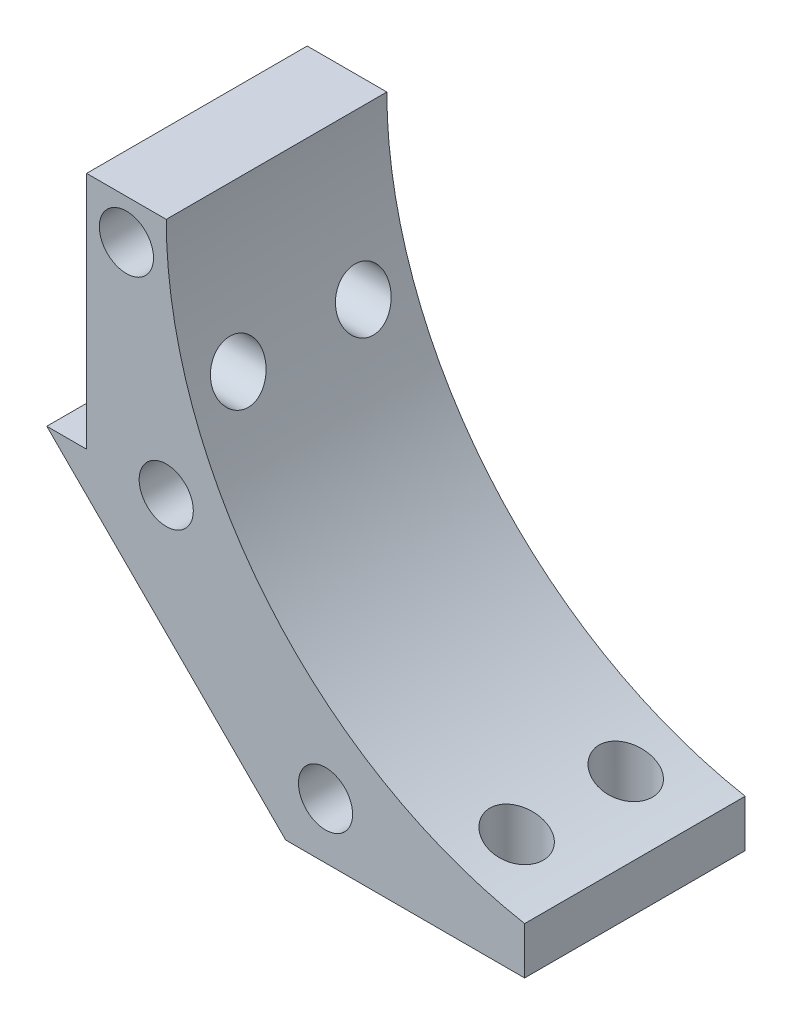
ISO-10303-21;
HEADER;
FILE_DESCRIPTION(('STEP AP214'),'2;1');
FILE_NAME('part.step','',(''),(''),'','','');
FILE_SCHEMA(('AUTOMOTIVE_DESIGN { 1 0 10303 214 1 1 1 1 }'));
ENDSEC;
DATA;
#1=APPLICATION_CONTEXT('core data for automotive mechanical design processes');
#2=APPLICATION_PROTOCOL_DEFINITION('international standard','automotive_design',2000,#1);
#3=PRODUCT_CONTEXT('',#1,'mechanical');
#4=PRODUCT('Part','Part','',(#3));
#5=PRODUCT_RELATED_PRODUCT_CATEGORY('part','',(#4));
#6=PRODUCT_DEFINITION_FORMATION('','',#4);
#7=PRODUCT_DEFINITION_CONTEXT('part definition',#1,'design');
#8=PRODUCT_DEFINITION('design','',#6,#7);
#9=PRODUCT_DEFINITION_SHAPE('','',#8);
#10=(LENGTH_UNIT() NAMED_UNIT(*) SI_UNIT(.MILLI.,.METRE.));
#11=(NAMED_UNIT(*) PLANE_ANGLE_UNIT() SI_UNIT($,.RADIAN.));
#12=(NAMED_UNIT(*) SI_UNIT($,.STERADIAN.) SOLID_ANGLE_UNIT());
#13=UNCERTAINTY_MEASURE_WITH_UNIT(LENGTH_MEASURE(1.E-05),#10,'distance_accuracy_value','');
#14=(GEOMETRIC_REPRESENTATION_CONTEXT(3) GLOBAL_UNCERTAINTY_ASSIGNED_CONTEXT((#13)) GLOBAL_UNIT_ASSIGNED_CONTEXT((#10,
#11,#12)) REPRESENTATION_CONTEXT('',''));
#15=CARTESIAN_POINT('',(0.,0.,0.));
#16=DIRECTION('',(0.,0.,1.));
#17=DIRECTION('',(1.,0.,0.));
#18=AXIS2_PLACEMENT_3D('',#15,#16,#17);
#19=CARTESIAN_POINT('',(0.,30.,27.7));
#20=DIRECTION('',(0.,1.,0.));
#21=DIRECTION('',(0.,0.,1.));
#22=AXIS2_PLACEMENT_3D('',#19,#20,#21);
#23=PLANE('',#22);
#24=DIRECTION('',(1.,0.,0.));
#25=VECTOR('',#24,1.);
#26=CARTESIAN_POINT('',(0.,30.,27.7));
#27=LINE('',#26,#25);
#28=CARTESIAN_POINT('',(0.,30.,27.7));
#29=VERTEX_POINT('',#28);
#30=CARTESIAN_POINT('',(5.,30.,27.7));
#31=VERTEX_POINT('',#30);
#32=EDGE_CURVE('E156',#29,#31,#27,.T.);
#33=ORIENTED_EDGE('',*,*,#32,.T.);
#34=DIRECTION('',(0.,0.,-1.));
#35=VECTOR('',#34,1.);
#36=CARTESIAN_POINT('',(5.,30.,27.7));
#37=LINE('',#36,#35);
#38=CARTESIAN_POINT('',(5.,30.,0.));
#39=VERTEX_POINT('',#38);
#40=EDGE_CURVE('E12',#31,#39,#37,.T.);
#41=ORIENTED_EDGE('',*,*,#40,.T.);
#42=DIRECTION('',(1.,0.,0.));
#43=VECTOR('',#42,1.);
#44=CARTESIAN_POINT('',(0.,30.,0.));
#45=LINE('',#44,#43);
#46=CARTESIAN_POINT('',(0.,30.,0.));
#47=VERTEX_POINT('',#46);
#48=EDGE_CURVE('E164',#47,#39,#45,.T.);
#49=ORIENTED_EDGE('',*,*,#48,.F.);
#50=DIRECTION('',(0.,0.,-1.));
#51=VECTOR('',#50,1.);
#52=CARTESIAN_POINT('',(0.,30.,27.7));
#53=LINE('',#52,#51);
#54=EDGE_CURVE('E145',#29,#47,#53,.T.);
#55=ORIENTED_EDGE('',*,*,#54,.F.);
#56=EDGE_LOOP('',(#33,#41,#49,#55));
#57=FACE_BOUND('',#56,.T.);
#58=ADVANCED_FACE('F74',(#57),#23,.T.);
#59=CARTESIAN_POINT('',(15.,15.,27.7));
#60=DIRECTION('',(0.707106781186548,0.707106781186548,0.));
#61=DIRECTION('',(-0.707106781186548,0.707106781186548,0.));
#62=AXIS2_PLACEMENT_3D('',#59,#60,#61);
#63=PLANE('',#62);
#64=DIRECTION('',(0.707106781186548,-0.707106781186548,0.));
#65=VECTOR('',#64,1.);
#66=CARTESIAN_POINT('',(15.,15.,0.));
#67=LINE('',#66,#65);
#68=CARTESIAN_POINT('',(30.,0.,0.));
#69=VERTEX_POINT('',#68);
#70=EDGE_CURVE('E148',#47,#69,#67,.T.);
#71=ORIENTED_EDGE('',*,*,#70,.T.);
#72=DIRECTION('',(0.,0.,-1.));
#73=VECTOR('',#72,1.);
#74=CARTESIAN_POINT('',(30.,0.,27.7));
#75=LINE('',#74,#73);
#76=CARTESIAN_POINT('',(30.,0.,27.7));
#77=VERTEX_POINT('',#76);
#78=EDGE_CURVE('E89',#77,#69,#75,.T.);
#79=ORIENTED_EDGE('',*,*,#78,.F.);
#80=DIRECTION('',(0.707106781186548,-0.707106781186548,0.));
#81=VECTOR('',#80,1.);
#82=CARTESIAN_POINT('',(15.,15.,27.7));
#83=LINE('',#82,#81);
#84=EDGE_CURVE('E150',#29,#77,#83,.T.);
#85=ORIENTED_EDGE('',*,*,#84,.F.);
#86=ORIENTED_EDGE('',*,*,#54,.T.);
#87=EDGE_LOOP('',(#71,#79,#85,#86));
#88=FACE_BOUND('',#87,.T.);
#89=ADVANCED_FACE('F147',(#88),#63,.F.);
#90=CARTESIAN_POINT('',(0.,0.,0.));
#91=DIRECTION('',(0.,0.,1.));
#92=DIRECTION('',(1.,0.,0.));
#93=AXIS2_PLACEMENT_3D('',#90,#91,#92);
#94=PLANE('',#93);
#95=CARTESIAN_POINT('',(10.,55.,0.));
#96=DIRECTION('',(0.,0.,1.));
#97=DIRECTION('',(1.,0.,0.));
#98=AXIS2_PLACEMENT_3D('',#95,#96,#97);
#99=CIRCLE('',#98,3.4);
#100=CARTESIAN_POINT('',(13.4,55.,0.));
#101=VERTEX_POINT('',#100);
#102=EDGE_CURVE('E292',#101,#101,#99,.T.);
#103=ORIENTED_EDGE('',*,*,#102,.T.);
#104=EDGE_LOOP('',(#103));
#105=FACE_BOUND('',#104,.T.);
#106=CARTESIAN_POINT('',(15.,30.,0.));
#107=DIRECTION('',(0.,0.,1.));
#108=DIRECTION('',(1.,0.,0.));
#109=AXIS2_PLACEMENT_3D('',#106,#107,#108);
#110=CIRCLE('',#109,3.4);
#111=CARTESIAN_POINT('',(18.4,30.,0.));
#112=VERTEX_POINT('',#111);
#113=EDGE_CURVE('E306',#112,#112,#110,.T.);
#114=ORIENTED_EDGE('',*,*,#113,.T.);
#115=EDGE_LOOP('',(#114));
#116=FACE_BOUND('',#115,.T.);
#117=CARTESIAN_POINT('',(35.,7.,0.));
#118=DIRECTION('',(0.,0.,1.));
#119=DIRECTION('',(1.,0.,0.));
#120=AXIS2_PLACEMENT_3D('',#117,#118,#119);
#121=CIRCLE('',#120,3.4);
#122=CARTESIAN_POINT('',(38.4,7.,0.));
#123=VERTEX_POINT('',#122);
#124=EDGE_CURVE('E328',#123,#123,#121,.T.);
#125=ORIENTED_EDGE('',*,*,#124,.T.);
#126=EDGE_LOOP('',(#125));
#127=FACE_BOUND('',#126,.T.);
#128=DIRECTION('',(1.,0.,0.));
#129=VECTOR('',#128,1.);
#130=CARTESIAN_POINT('',(5.,60.,0.));
#131=LINE('',#130,#129);
#132=CARTESIAN_POINT('',(5.,60.,0.));
#133=VERTEX_POINT('',#132);
#134=CARTESIAN_POINT('',(15.,60.,0.));
#135=VERTEX_POINT('',#134);
#136=EDGE_CURVE('E202',#133,#135,#131,.T.);
#137=ORIENTED_EDGE('',*,*,#136,.T.);
#138=CARTESIAN_POINT('',(70.,60.,0.));
#139=DIRECTION('',(0.,0.,1.));
#140=DIRECTION('',(1.,0.,0.));
#141=AXIS2_PLACEMENT_3D('',#138,#139,#140);
#142=CIRCLE('',#141,55.);
#143=CARTESIAN_POINT('',(60.,5.91673086804016,0.));
#144=VERTEX_POINT('',#143);
#145=EDGE_CURVE('E128',#135,#144,#142,.T.);
#146=ORIENTED_EDGE('',*,*,#145,.T.);
#147=DIRECTION('',(0.,-1.,0.));
#148=VECTOR('',#147,1.);
#149=CARTESIAN_POINT('',(60.,30.,0.));
#150=LINE('',#149,#148);
#151=CARTESIAN_POINT('',(60.,0.,0.));
#152=VERTEX_POINT('',#151);
#153=EDGE_CURVE('E184',#144,#152,#150,.T.);
#154=ORIENTED_EDGE('',*,*,#153,.T.);
#155=DIRECTION('',(1.,0.,0.));
#156=VECTOR('',#155,1.);
#157=CARTESIAN_POINT('',(30.,0.,0.));
#158=LINE('',#157,#156);
#159=EDGE_CURVE('E166',#69,#152,#158,.T.);
#160=ORIENTED_EDGE('',*,*,#159,.F.);
#161=ORIENTED_EDGE('',*,*,#70,.F.);
#162=ORIENTED_EDGE('',*,*,#48,.T.);
#163=DIRECTION('',(0.,1.,0.));
#164=VECTOR('',#163,1.);
#165=CARTESIAN_POINT('',(5.,30.,0.));
#166=LINE('',#165,#164);
#167=EDGE_CURVE('E199',#39,#133,#166,.T.);
#168=ORIENTED_EDGE('',*,*,#167,.T.);
#169=EDGE_LOOP('',(#137,#146,#154,#160,#161,#162,#168));
#170=FACE_BOUND('',#169,.T.);
#171=ADVANCED_FACE('F162',(#105,#116,#127,#170),#94,.F.);
#172=CARTESIAN_POINT('',(0.,0.,27.7));
#173=DIRECTION('',(0.,0.,1.));
#174=DIRECTION('',(1.,0.,0.));
#175=AXIS2_PLACEMENT_3D('',#172,#173,#174);
#176=PLANE('',#175);
#177=CARTESIAN_POINT('',(10.,55.,27.7));
#178=DIRECTION('',(0.,0.,1.));
#179=DIRECTION('',(1.,0.,0.));
#180=AXIS2_PLACEMENT_3D('',#177,#178,#179);
#181=CIRCLE('',#180,3.4);
#182=CARTESIAN_POINT('',(13.4,55.,27.7));
#183=VERTEX_POINT('',#182);
#184=EDGE_CURVE('E314',#183,#183,#181,.T.);
#185=ORIENTED_EDGE('',*,*,#184,.F.);
#186=EDGE_LOOP('',(#185));
#187=FACE_BOUND('',#186,.T.);
#188=CARTESIAN_POINT('',(15.,30.,27.7));
#189=DIRECTION('',(0.,0.,1.));
#190=DIRECTION('',(1.,0.,0.));
#191=AXIS2_PLACEMENT_3D('',#188,#189,#190);
#192=CIRCLE('',#191,3.4);
#193=CARTESIAN_POINT('',(18.4,30.,27.7));
#194=VERTEX_POINT('',#193);
#195=EDGE_CURVE('E309',#194,#194,#192,.T.);
#196=ORIENTED_EDGE('',*,*,#195,.F.);
#197=EDGE_LOOP('',(#196));
#198=FACE_BOUND('',#197,.T.);
#199=CARTESIAN_POINT('',(35.,7.,27.7));
#200=DIRECTION('',(0.,0.,1.));
#201=DIRECTION('',(1.,0.,0.));
#202=AXIS2_PLACEMENT_3D('',#199,#200,#201);
#203=CIRCLE('',#202,3.4);
#204=CARTESIAN_POINT('',(38.4,7.,27.7));
#205=VERTEX_POINT('',#204);
#206=EDGE_CURVE('E310',#205,#205,#203,.T.);
#207=ORIENTED_EDGE('',*,*,#206,.F.);
#208=EDGE_LOOP('',(#207));
#209=FACE_BOUND('',#208,.T.);
#210=CARTESIAN_POINT('',(70.,60.,27.7));
#211=DIRECTION('',(0.,0.,1.));
#212=DIRECTION('',(1.,0.,0.));
#213=AXIS2_PLACEMENT_3D('',#210,#211,#212);
#214=CIRCLE('',#213,55.);
#215=CARTESIAN_POINT('',(15.,60.,27.7));
#216=VERTEX_POINT('',#215);
#217=CARTESIAN_POINT('',(60.,5.91673086804016,27.7));
#218=VERTEX_POINT('',#217);
#219=EDGE_CURVE('E97',#216,#218,#214,.T.);
#220=ORIENTED_EDGE('',*,*,#219,.F.);
#221=DIRECTION('',(1.,0.,0.));
#222=VECTOR('',#221,1.);
#223=CARTESIAN_POINT('',(5.,60.,27.7));
#224=LINE('',#223,#222);
#225=CARTESIAN_POINT('',(5.,60.,27.7));
#226=VERTEX_POINT('',#225);
#227=EDGE_CURVE('E194',#226,#216,#224,.T.);
#228=ORIENTED_EDGE('',*,*,#227,.F.);
#229=DIRECTION('',(0.,1.,0.));
#230=VECTOR('',#229,1.);
#231=CARTESIAN_POINT('',(5.,30.,27.7));
#232=LINE('',#231,#230);
#233=EDGE_CURVE('E198',#31,#226,#232,.T.);
#234=ORIENTED_EDGE('',*,*,#233,.F.);
#235=ORIENTED_EDGE('',*,*,#32,.F.);
#236=ORIENTED_EDGE('',*,*,#84,.T.);
#237=DIRECTION('',(1.,0.,0.));
#238=VECTOR('',#237,1.);
#239=CARTESIAN_POINT('',(30.,0.,27.7));
#240=LINE('',#239,#238);
#241=CARTESIAN_POINT('',(60.,0.,27.7));
#242=VERTEX_POINT('',#241);
#243=EDGE_CURVE('E180',#77,#242,#240,.T.);
#244=ORIENTED_EDGE('',*,*,#243,.T.);
#245=DIRECTION('',(0.,-1.,0.));
#246=VECTOR('',#245,1.);
#247=CARTESIAN_POINT('',(60.,30.,27.7));
#248=LINE('',#247,#246);
#249=EDGE_CURVE('E183',#218,#242,#248,.T.);
#250=ORIENTED_EDGE('',*,*,#249,.F.);
#251=EDGE_LOOP('',(#220,#228,#234,#235,#236,#244,#250));
#252=FACE_BOUND('',#251,.T.);
#253=ADVANCED_FACE('F268',(#187,#198,#209,#252),#176,.T.);
#254=CARTESIAN_POINT('',(5.,30.,27.7));
#255=DIRECTION('',(-1.,0.,0.));
#256=DIRECTION('',(0.,-1.,0.));
#257=AXIS2_PLACEMENT_3D('',#254,#255,#256);
#258=PLANE('',#257);
#259=CARTESIAN_POINT('',(5.,42.,6.));
#260=DIRECTION('',(-1.,0.,0.));
#261=DIRECTION('',(0.,-1.,0.));
#262=AXIS2_PLACEMENT_3D('',#259,#260,#261);
#263=CIRCLE('',#262,3.3);
#264=CARTESIAN_POINT('',(5.,38.7,6.));
#265=VERTEX_POINT('',#264);
#266=EDGE_CURVE('E218',#265,#265,#263,.T.);
#267=ORIENTED_EDGE('',*,*,#266,.F.);
#268=EDGE_LOOP('',(#267));
#269=FACE_BOUND('',#268,.T.);
#270=CARTESIAN_POINT('',(5.,42.,21.7));
#271=DIRECTION('',(-1.,0.,0.));
#272=DIRECTION('',(0.,-1.,0.));
#273=AXIS2_PLACEMENT_3D('',#270,#271,#272);
#274=CIRCLE('',#273,3.3);
#275=CARTESIAN_POINT('',(5.,38.7,21.7));
#276=VERTEX_POINT('',#275);
#277=EDGE_CURVE('E281',#276,#276,#274,.T.);
#278=ORIENTED_EDGE('',*,*,#277,.F.);
#279=EDGE_LOOP('',(#278));
#280=FACE_BOUND('',#279,.T.);
#281=ORIENTED_EDGE('',*,*,#167,.F.);
#282=ORIENTED_EDGE('',*,*,#40,.F.);
#283=ORIENTED_EDGE('',*,*,#233,.T.);
#284=DIRECTION('',(0.,0.,-1.));
#285=VECTOR('',#284,1.);
#286=CARTESIAN_POINT('',(5.,60.,27.7));
#287=LINE('',#286,#285);
#288=EDGE_CURVE('E122',#226,#133,#287,.T.);
#289=ORIENTED_EDGE('',*,*,#288,.T.);
#290=EDGE_LOOP('',(#281,#282,#283,#289));
#291=FACE_BOUND('',#290,.T.);
#292=ADVANCED_FACE('F266',(#269,#280,#291),#258,.T.);
#293=CARTESIAN_POINT('',(5.,60.,27.7));
#294=DIRECTION('',(0.,1.,0.));
#295=DIRECTION('',(0.,0.,1.));
#296=AXIS2_PLACEMENT_3D('',#293,#294,#295);
#297=PLANE('',#296);
#298=DIRECTION('',(0.,0.,1.));
#299=VECTOR('',#298,1.);
#300=CARTESIAN_POINT('',(15.,60.,-12.3));
#301=LINE('',#300,#299);
#302=EDGE_CURVE('E284',#135,#216,#301,.T.);
#303=ORIENTED_EDGE('',*,*,#302,.F.);
#304=ORIENTED_EDGE('',*,*,#136,.F.);
#305=ORIENTED_EDGE('',*,*,#288,.F.);
#306=ORIENTED_EDGE('',*,*,#227,.T.);
#307=EDGE_LOOP('',(#303,#304,#305,#306));
#308=FACE_BOUND('',#307,.T.);
#309=ADVANCED_FACE('F76',(#308),#297,.T.);
#310=CARTESIAN_POINT('',(60.,30.,27.7));
#311=DIRECTION('',(1.,0.,0.));
#312=DIRECTION('',(0.,1.,0.));
#313=AXIS2_PLACEMENT_3D('',#310,#311,#312);
#314=PLANE('',#313);
#315=DIRECTION('',(0.,0.,1.));
#316=VECTOR('',#315,1.);
#317=CARTESIAN_POINT('',(60.,5.91673086804016,-12.3));
#318=LINE('',#317,#316);
#319=EDGE_CURVE('E286',#144,#218,#318,.T.);
#320=ORIENTED_EDGE('',*,*,#319,.T.);
#321=ORIENTED_EDGE('',*,*,#249,.T.);
#322=DIRECTION('',(0.,0.,-1.));
#323=VECTOR('',#322,1.);
#324=CARTESIAN_POINT('',(60.,0.,27.7));
#325=LINE('',#324,#323);
#326=EDGE_CURVE('E168',#242,#152,#325,.T.);
#327=ORIENTED_EDGE('',*,*,#326,.T.);
#328=ORIENTED_EDGE('',*,*,#153,.F.);
#329=EDGE_LOOP('',(#320,#321,#327,#328));
#330=FACE_BOUND('',#329,.T.);
#331=ADVANCED_FACE('F250',(#330),#314,.T.);
#332=CARTESIAN_POINT('',(30.,0.,27.7));
#333=DIRECTION('',(0.,1.,0.));
#334=DIRECTION('',(0.,0.,1.));
#335=AXIS2_PLACEMENT_3D('',#332,#333,#334);
#336=PLANE('',#335);
#337=CARTESIAN_POINT('',(52.,0.,20.7));
#338=DIRECTION('',(0.,-1.,0.));
#339=DIRECTION('',(0.,0.,-1.));
#340=AXIS2_PLACEMENT_3D('',#337,#338,#339);
#341=CIRCLE('',#340,3.35);
#342=CARTESIAN_POINT('',(52.,0.,17.35));
#343=VERTEX_POINT('',#342);
#344=EDGE_CURVE('E353',#343,#343,#341,.T.);
#345=ORIENTED_EDGE('',*,*,#344,.F.);
#346=EDGE_LOOP('',(#345));
#347=FACE_BOUND('',#346,.T.);
#348=CARTESIAN_POINT('',(52.,0.,7.));
#349=DIRECTION('',(0.,-1.,0.));
#350=DIRECTION('',(0.,0.,-1.));
#351=AXIS2_PLACEMENT_3D('',#348,#349,#350);
#352=CIRCLE('',#351,3.35);
#353=CARTESIAN_POINT('',(52.,0.,3.65));
#354=VERTEX_POINT('',#353);
#355=EDGE_CURVE('E349',#354,#354,#352,.T.);
#356=ORIENTED_EDGE('',*,*,#355,.F.);
#357=EDGE_LOOP('',(#356));
#358=FACE_BOUND('',#357,.T.);
#359=ORIENTED_EDGE('',*,*,#159,.T.);
#360=ORIENTED_EDGE('',*,*,#326,.F.);
#361=ORIENTED_EDGE('',*,*,#243,.F.);
#362=ORIENTED_EDGE('',*,*,#78,.T.);
#363=EDGE_LOOP('',(#359,#360,#361,#362));
#364=FACE_BOUND('',#363,.T.);
#365=ADVANCED_FACE('F248',(#347,#358,#364),#336,.F.);
#366=CARTESIAN_POINT('',(70.,60.,-12.3));
#367=DIRECTION('',(0.,0.,1.));
#368=DIRECTION('',(1.,0.,0.));
#369=AXIS2_PLACEMENT_3D('',#366,#367,#368);
#370=CYLINDRICAL_SURFACE('',#369,55.);
#371=CARTESIAN_POINT('',(52.,8.02885415925488,17.35));
#372=CARTESIAN_POINT('',(52.1937255928964,7.96175966903525,17.3500069855912));
#373=CARTESIAN_POINT('',(52.3879549351759,7.89571289823824,17.3668434345665));
#374=CARTESIAN_POINT('',(52.7719536091635,7.76748617542826,17.4343224068194));
#375=CARTESIAN_POINT('',(52.9617183175783,7.70531013075279,17.4849985037168));
#376=CARTESIAN_POINT('',(53.3312530549722,7.58635103626325,17.619583932879));
#377=CARTESIAN_POINT('',(53.5110094691698,7.52957526180082,17.7035373321481));
#378=CARTESIAN_POINT('',(53.854327108766,7.42291766016296,17.9029741046028));
#379=CARTESIAN_POINT('',(54.0178942512536,7.37303331155169,18.018445899571));
#380=CARTESIAN_POINT('',(54.3177903075109,7.28290585001171,18.2735322180667));
#381=CARTESIAN_POINT('',(54.4548684290028,7.24238786603704,18.4121679433547));
#382=CARTESIAN_POINT('',(54.7037250811666,7.1696978360233,18.7124475115232));
#383=CARTESIAN_POINT('',(54.8155092518957,7.13752392918362,18.8740862120693));
#384=CARTESIAN_POINT('',(55.0052738400017,7.08339079048497,19.2079989733584));
#385=CARTESIAN_POINT('',(55.0845335779657,7.06104182293522,19.3794834303835));
#386=CARTESIAN_POINT('',(55.2132799094761,7.02493589278056,19.7341339933138));
#387=CARTESIAN_POINT('',(55.2627723965165,7.01117722939657,19.9172977789296));
#388=CARTESIAN_POINT('',(55.3291519689899,6.99276110711162,20.2841342546611));
#389=CARTESIAN_POINT('',(55.3469796616679,6.98784104337926,20.4676241074551));
#390=CARTESIAN_POINT('',(55.3523136968002,6.98636685683869,20.8350696809798));
#391=CARTESIAN_POINT('',(55.3398228844693,6.98981194900945,21.0190253563773));
#392=CARTESIAN_POINT('',(55.2852749892411,7.00492815494913,21.3800153271878));
#393=CARTESIAN_POINT('',(55.243551978695,7.01650632586046,21.5571041942008));
#394=CARTESIAN_POINT('',(55.1323258366619,7.04761030665252,21.9015803575614));
#395=CARTESIAN_POINT('',(55.0628225690763,7.06713615546981,22.068967606375));
#396=CARTESIAN_POINT('',(54.8977005738219,7.11400999497293,22.3907980494473));
#397=CARTESIAN_POINT('',(54.8018815574567,7.14141805568686,22.5451295884977));
#398=CARTESIAN_POINT('',(54.5874916113905,7.20353225413362,22.8354051556056));
#399=CARTESIAN_POINT('',(54.4689185373956,7.23823907971613,22.9713474486396));
#400=CARTESIAN_POINT('',(54.2093802688282,7.3153240724868,23.2248532767505));
#401=CARTESIAN_POINT('',(54.067917065259,7.35787677594025,23.3418533687532));
#402=CARTESIAN_POINT('',(53.769225193632,7.44920244545765,23.5505358464813));
#403=CARTESIAN_POINT('',(53.6119937833013,7.49797649388769,23.6422138179537));
#404=CARTESIAN_POINT('',(53.2796708884943,7.60284250231889,23.8016531268097));
#405=CARTESIAN_POINT('',(53.1041156471387,7.659149739674,23.8683056141601));
#406=CARTESIAN_POINT('',(52.745741457348,7.77619208068739,23.9712618172341));
#407=CARTESIAN_POINT('',(52.5629208716881,7.83692818498255,24.0075586513057));
#408=CARTESIAN_POINT('',(52.1864920481171,7.96424176327001,24.0504027151675));
#409=CARTESIAN_POINT('',(51.9927694384325,8.0309591636161,24.0555327188786));
#410=CARTESIAN_POINT('',(51.607835798488,8.16593846994462,24.0325524953064));
#411=CARTESIAN_POINT('',(51.4166253373581,8.23420071669243,24.0044348626929));
#412=CARTESIAN_POINT('',(51.035702081529,8.37250973530423,23.9143646442022));
#413=CARTESIAN_POINT('',(50.8462324669067,8.44254381387695,23.8513594036077));
#414=CARTESIAN_POINT('',(50.4805987826813,8.57985658888166,23.6922689081001));
#415=CARTESIAN_POINT('',(50.3044359822722,8.64713502220285,23.5961805025853));
#416=CARTESIAN_POINT('',(49.9714536889451,8.77608856660455,23.3734696713473));
#417=CARTESIAN_POINT('',(49.8145533899609,8.83778677796727,23.2469818800094));
#418=CARTESIAN_POINT('',(49.5245221090461,8.95316656415963,22.96610266275));
#419=CARTESIAN_POINT('',(49.3913844559879,9.00685038825473,22.8117190928624));
#420=CARTESIAN_POINT('',(49.1602409504435,9.10089141278103,22.4876815544306));
#421=CARTESIAN_POINT('',(49.0607738285578,9.14179440625306,22.3192309115603));
#422=CARTESIAN_POINT('',(48.8920681748462,9.21157995137888,21.9655360169756));
#423=CARTESIAN_POINT('',(48.8228121665704,9.24046945211489,21.7803015494304));
#424=CARTESIAN_POINT('',(48.7217578506919,9.28275250812478,21.4134778031477));
#425=CARTESIAN_POINT('',(48.6875195797632,9.29715408586007,21.2326752319913));
#426=CARTESIAN_POINT('',(48.6491522041705,9.31329800240582,20.8673655582518));
#427=CARTESIAN_POINT('',(48.6450125600682,9.31504477246632,20.6828597750938));
#428=CARTESIAN_POINT('',(48.6664558171519,9.30601623377659,20.3251884747162));
#429=CARTESIAN_POINT('',(48.6905667453258,9.29586105897473,20.1519162886503));
#430=CARTESIAN_POINT('',(48.7651090535941,9.26459794068265,19.8121795532235));
#431=CARTESIAN_POINT('',(48.8155404345105,9.24348999685038,19.6457150040751));
#432=CARTESIAN_POINT('',(48.9413030861318,9.19118260049071,19.3226190449483));
#433=CARTESIAN_POINT('',(49.0168332701339,9.15990257586224,19.1660784825364));
#434=CARTESIAN_POINT('',(49.1900455184777,9.08875827111128,18.8679526172504));
#435=CARTESIAN_POINT('',(49.2877316199682,9.04889242658728,18.7263700468528));
#436=CARTESIAN_POINT('',(49.5084023661998,8.95972820826877,18.4534554665003));
#437=CARTESIAN_POINT('',(49.6325112866749,8.91002182836998,18.3231670713235));
#438=CARTESIAN_POINT('',(49.8985302169926,8.80477201643767,18.0849985977878));
#439=CARTESIAN_POINT('',(50.0404500412195,8.74922536898648,17.9771309617137));
#440=CARTESIAN_POINT('',(50.3491993949393,8.63001524248001,17.7787983865507));
#441=CARTESIAN_POINT('',(50.5170888948596,8.56605526044738,17.6901619916019));
#442=CARTESIAN_POINT('',(50.8644788531704,8.43580548193586,17.542682052271));
#443=CARTESIAN_POINT('',(51.043970016269,8.36951756958248,17.4838149822757));
#444=CARTESIAN_POINT('',(51.3534150522882,8.25714496580315,17.4104196483377));
#445=CARTESIAN_POINT('',(51.4815432690415,8.21114491702823,17.3878120699865));
#446=CARTESIAN_POINT('',(51.7397050221516,8.11955672158108,17.3575996049304));
#447=CARTESIAN_POINT('',(51.8697386325595,8.07396859102954,17.3499953028784));
#448=CARTESIAN_POINT('',(52.,8.02885415925488,17.35));
#449=B_SPLINE_CURVE_WITH_KNOTS('',3,(#371,#372,#373,#374,#375,#376,#377,#378,#379,#380,#381,
#382,#383,#384,#385,#386,#387,#388,#389,#390,#391,#392,#393,#394,#395,#396,#397,#398,#399,#400,
#401,#402,#403,#404,#405,#406,#407,#408,#409,#410,#411,#412,#413,#414,#415,#416,#417,#418,#419,
#420,#421,#422,#423,#424,#425,#426,#427,#428,#429,#430,#431,#432,#433,#434,#435,#436,#437,#438,
#439,#440,#441,#442,#443,#444,#445,#446,#447,#448),.UNSPECIFIED.,.T.,.F.,(4,2,2,2,2,2,2,2,2,2,2,
2,2,2,2,2,2,2,2,2,2,2,2,2,2,2,2,2,2,2,2,2,2,2,2,2,2,2,4),(0.,0.614565005967665,1.22974065329566,
1.84573367466168,2.46150071610151,3.05586221520588,3.65009105240974,4.21796596688904,
4.78572841313875,5.33632404908355,5.88686801684148,6.43122074554409,6.97557614112452,
7.52419527093911,8.07286612686778,8.63566637759353,9.19856467606972,9.78407792120177,
10.3697238667251,10.9818124276964,11.5940373463876,12.2258291670708,12.8576811716904,
13.4867847577653,14.1157114504763,14.7120985596215,15.3081402132525,15.8590330863901,
16.4097330476975,16.9329695071734,17.4562059829891,17.9836922548453,18.5112747201378,
19.0689160113752,19.6268659413927,20.2252650351864,20.823190494075,21.2364087863458,
21.6496431807359),.UNSPECIFIED.);
#450=CARTESIAN_POINT('',(52.,8.02885415925488,17.35));
#451=VERTEX_POINT('',#450);
#452=EDGE_CURVE('E78',#451,#451,#449,.T.);
#453=ORIENTED_EDGE('',*,*,#452,.T.);
#454=EDGE_LOOP('',(#453));
#455=FACE_BOUND('',#454,.T.);
#456=CARTESIAN_POINT('',(52.,8.02885415925488,3.65));
#457=CARTESIAN_POINT('',(52.1937255928964,7.96175966903525,3.65000698559124));
#458=CARTESIAN_POINT('',(52.3879549351759,7.89571289823824,3.66684343456649));
#459=CARTESIAN_POINT('',(52.7719536091635,7.76748617542826,3.73432240681939));
#460=CARTESIAN_POINT('',(52.9617183175783,7.70531013075279,3.78499850371677));
#461=CARTESIAN_POINT('',(53.3312530549722,7.58635103626325,3.91958393287896));
#462=CARTESIAN_POINT('',(53.5110094691698,7.52957526180082,4.00353733214813));
#463=CARTESIAN_POINT('',(53.854327108766,7.42291766016296,4.20297410460283));
#464=CARTESIAN_POINT('',(54.0178942512536,7.37303331155169,4.31844589957104));
#465=CARTESIAN_POINT('',(54.3177903075109,7.28290585001171,4.57353221806673));
#466=CARTESIAN_POINT('',(54.4548684290028,7.24238786603704,4.71216794335468));
#467=CARTESIAN_POINT('',(54.7037250811666,7.1696978360233,5.01244751152322));
#468=CARTESIAN_POINT('',(54.8155092518957,7.13752392918362,5.17408621206931));
#469=CARTESIAN_POINT('',(55.0052738400017,7.08339079048497,5.50799897335839));
#470=CARTESIAN_POINT('',(55.0845335779657,7.06104182293522,5.6794834303835));
#471=CARTESIAN_POINT('',(55.2132799094761,7.02493589278056,6.03413399331378));
#472=CARTESIAN_POINT('',(55.2627723965165,7.01117722939657,6.21729777892963));
#473=CARTESIAN_POINT('',(55.3291519689899,6.99276110711161,6.58413425466106));
#474=CARTESIAN_POINT('',(55.3469796616679,6.98784104337926,6.76762410745511));
#475=CARTESIAN_POINT('',(55.3523136968002,6.98636685683869,7.13506968097978));
#476=CARTESIAN_POINT('',(55.3398228844693,6.98981194900945,7.31902535637728));
#477=CARTESIAN_POINT('',(55.2852749892411,7.00492815494913,7.68001532718777));
#478=CARTESIAN_POINT('',(55.243551978695,7.01650632586045,7.85710419420084));
#479=CARTESIAN_POINT('',(55.1323258366619,7.04761030665251,8.20158035756139));
#480=CARTESIAN_POINT('',(55.0628225690763,7.06713615546981,8.36896760637496));
#481=CARTESIAN_POINT('',(54.8977005738219,7.11400999497293,8.69079804944733));
#482=CARTESIAN_POINT('',(54.8018815574567,7.14141805568686,8.84512958849767));
#483=CARTESIAN_POINT('',(54.5874916113905,7.20353225413362,9.13540515560562));
#484=CARTESIAN_POINT('',(54.4689185373956,7.23823907971614,9.27134744863959));
#485=CARTESIAN_POINT('',(54.2093802688282,7.31532407248682,9.52485327675048));
#486=CARTESIAN_POINT('',(54.067917065259,7.35787677594026,9.6418533687532));
#487=CARTESIAN_POINT('',(53.769225193632,7.44920244545766,9.85053584648129));
#488=CARTESIAN_POINT('',(53.6119937833013,7.49797649388768,9.94221381795373));
#489=CARTESIAN_POINT('',(53.2796708884943,7.60284250231888,10.1016531268097));
#490=CARTESIAN_POINT('',(53.1041156471387,7.659149739674,10.1683056141601));
#491=CARTESIAN_POINT('',(52.745741457348,7.7761920806874,10.2712618172341));
#492=CARTESIAN_POINT('',(52.5629208716881,7.83692818498255,10.3075586513057));
#493=CARTESIAN_POINT('',(52.1864920481171,7.96424176327002,10.3504027151675));
#494=CARTESIAN_POINT('',(51.9927694384325,8.03095916361611,10.3555327188786));
#495=CARTESIAN_POINT('',(51.607835798488,8.16593846994462,10.3325524953064));
#496=CARTESIAN_POINT('',(51.4166253373581,8.23420071669243,10.3044348626929));
#497=CARTESIAN_POINT('',(51.035702081529,8.37250973530423,10.2143646442022));
#498=CARTESIAN_POINT('',(50.8462324669067,8.44254381387696,10.1513594036077));
#499=CARTESIAN_POINT('',(50.4805987826813,8.57985658888167,9.99226890810006));
#500=CARTESIAN_POINT('',(50.3044359822722,8.64713502220286,9.89618050258534));
#501=CARTESIAN_POINT('',(49.9714536889451,8.77608856660455,9.67346967134728));
#502=CARTESIAN_POINT('',(49.8145533899609,8.83778677796727,9.54698188000945));
#503=CARTESIAN_POINT('',(49.5245221090461,8.95316656415963,9.26610266274996));
#504=CARTESIAN_POINT('',(49.3913844559879,9.00685038825473,9.11171909286239));
#505=CARTESIAN_POINT('',(49.1602409504435,9.10089141278103,8.78768155443064));
#506=CARTESIAN_POINT('',(49.0607738285578,9.14179440625306,8.61923091156035));
#507=CARTESIAN_POINT('',(48.8920681748462,9.21157995137888,8.26553601697557));
#508=CARTESIAN_POINT('',(48.8228121665704,9.24046945211489,8.08030154943038));
#509=CARTESIAN_POINT('',(48.7217578506919,9.28275250812478,7.71347780314774));
#510=CARTESIAN_POINT('',(48.6875195797632,9.29715408586007,7.53267523199131));
#511=CARTESIAN_POINT('',(48.6491522041705,9.31329800240582,7.1673655582518));
#512=CARTESIAN_POINT('',(48.6450125600682,9.31504477246632,6.98285977509377));
#513=CARTESIAN_POINT('',(48.6664558171519,9.30601623377659,6.62518847471616));
#514=CARTESIAN_POINT('',(48.6905667453258,9.29586105897473,6.45191628865034));
#515=CARTESIAN_POINT('',(48.7651090535941,9.26459794068264,6.11217955322351));
#516=CARTESIAN_POINT('',(48.8155404345105,9.24348999685038,5.94571500407508));
#517=CARTESIAN_POINT('',(48.9413030861318,9.19118260049071,5.62261904494832));
#518=CARTESIAN_POINT('',(49.0168332701339,9.15990257586224,5.46607848253642));
#519=CARTESIAN_POINT('',(49.1900455184777,9.08875827111128,5.16795261725042));
#520=CARTESIAN_POINT('',(49.2877316199682,9.04889242658728,5.02637004685282));
#521=CARTESIAN_POINT('',(49.5084023661998,8.95972820826877,4.75345546650026));
#522=CARTESIAN_POINT('',(49.6325112866749,8.91002182836998,4.62316707132348));
#523=CARTESIAN_POINT('',(49.8985302169926,8.80477201643767,4.38499859778779));
#524=CARTESIAN_POINT('',(50.0404500412195,8.74922536898648,4.27713096171374));
#525=CARTESIAN_POINT('',(50.3491993949393,8.63001524248001,4.07879838655068));
#526=CARTESIAN_POINT('',(50.5170888948596,8.56605526044738,3.9901619916019));
#527=CARTESIAN_POINT('',(50.8644788531704,8.43580548193585,3.842682052271));
#528=CARTESIAN_POINT('',(51.043970016269,8.36951756958247,3.78381498227568));
#529=CARTESIAN_POINT('',(51.3534150522882,8.25714496580315,3.71041964833773));
#530=CARTESIAN_POINT('',(51.4815432690415,8.21114491702823,3.68781206998653));
#531=CARTESIAN_POINT('',(51.7397050221516,8.11955672158108,3.65759960493036));
#532=CARTESIAN_POINT('',(51.8697386325595,8.07396859102953,3.64999530287839));
#533=CARTESIAN_POINT('',(52.,8.02885415925488,3.65));
#534=B_SPLINE_CURVE_WITH_KNOTS('',3,(#456,#457,#458,#459,#460,#461,#462,#463,#464,#465,#466,
#467,#468,#469,#470,#471,#472,#473,#474,#475,#476,#477,#478,#479,#480,#481,#482,#483,#484,#485,
#486,#487,#488,#489,#490,#491,#492,#493,#494,#495,#496,#497,#498,#499,#500,#501,#502,#503,#504,
#505,#506,#507,#508,#509,#510,#511,#512,#513,#514,#515,#516,#517,#518,#519,#520,#521,#522,#523,
#524,#525,#526,#527,#528,#529,#530,#531,#532,#533),.UNSPECIFIED.,.T.,.F.,(4,2,2,2,2,2,2,2,2,2,2,
2,2,2,2,2,2,2,2,2,2,2,2,2,2,2,2,2,2,2,2,2,2,2,2,2,2,2,4),(0.,0.614565005967665,1.22974065329566,
1.84573367466168,2.46150071610152,3.05586221520588,3.65009105240974,4.21796596688904,
4.78572841313875,5.33632404908355,5.88686801684149,6.4312207455441,6.97557614112453,
7.52419527093911,8.07286612686779,8.63566637759354,9.19856467606973,9.78407792120179,
10.3697238667252,10.9818124276963,11.5940373463876,12.2258291670708,12.8576811716904,
13.4867847577653,14.1157114504763,14.7120985596215,15.3081402132525,15.8590330863901,
16.4097330476975,16.9329695071734,17.4562059829891,17.9836922548453,18.5112747201378,
19.0689160113752,19.6268659413927,20.2252650351864,20.823190494075,21.2364087863458,
21.6496431807359),.UNSPECIFIED.);
#535=CARTESIAN_POINT('',(52.,8.02885415925488,3.65));
#536=VERTEX_POINT('',#535);
#537=EDGE_CURVE('E313',#536,#536,#534,.T.);
#538=ORIENTED_EDGE('',*,*,#537,.T.);
#539=EDGE_LOOP('',(#538));
#540=FACE_BOUND('',#539,.T.);
#541=CARTESIAN_POINT('',(19.2919138598192,38.7,6.));
#542=CARTESIAN_POINT('',(19.291907872471,38.7000120015256,6.17519346029912));
#543=CARTESIAN_POINT('',(19.2860179902889,38.7140192086883,6.35053279109458));
#544=CARTESIAN_POINT('',(19.2627655459288,38.7695054211239,6.69615194109139));
#545=CARTESIAN_POINT('',(19.2453884159871,38.8110193096541,6.86642504856428));
#546=CARTESIAN_POINT('',(19.2001506500586,38.9197073992752,7.19663399031623));
#547=CARTESIAN_POINT('',(19.1723140825554,38.986822693653,7.3565925769916));
#548=CARTESIAN_POINT('',(19.107527936461,39.1442214998062,7.66257249594359));
#549=CARTESIAN_POINT('',(19.0705791040173,39.2345031146583,7.80859496800594));
#550=CARTESIAN_POINT('',(18.9877158586017,39.4388857683991,8.08848735224764));
#551=CARTESIAN_POINT('',(18.9415291698657,39.553720163375,8.22173982448268));
#552=CARTESIAN_POINT('',(18.8429500568079,39.8016330422146,8.46731724176852));
#553=CARTESIAN_POINT('',(18.7905557077414,39.9347171866121,8.57963566809542));
#554=CARTESIAN_POINT('',(18.6774138229843,40.2258194639277,8.78866729055979));
#555=CARTESIAN_POINT('',(18.6163361042514,40.3849455999432,8.88365979385289));
#556=CARTESIAN_POINT('',(18.4912299516468,40.7158637006896,9.04547954532608));
#557=CARTESIAN_POINT('',(18.4272005971314,40.8876596274102,9.11229793888285));
#558=CARTESIAN_POINT('',(18.2945457546633,41.2493977334841,9.21933270192591));
#559=CARTESIAN_POINT('',(18.2258622661163,41.4398179070378,9.25786876267067));
#560=CARTESIAN_POINT('',(18.0894548974984,41.8248238516068,9.30103726344263));
#561=CARTESIAN_POINT('',(18.0217311469676,42.0194101762114,9.30566516943298));
#562=CARTESIAN_POINT('',(17.8882030884662,42.4101214966943,9.28034346892426));
#563=CARTESIAN_POINT('',(17.8224395243166,42.6062292794932,9.24990344787721));
#564=CARTESIAN_POINT('',(17.6956607625696,42.991261621023,9.15384723643963));
#565=CARTESIAN_POINT('',(17.634645040776,43.180186971565,9.08823493565147));
#566=CARTESIAN_POINT('',(17.5204946862692,43.5398596430407,8.92519788721647));
#567=CARTESIAN_POINT('',(17.4671944169488,43.7109553689679,8.82865948506066));
#568=CARTESIAN_POINT('',(17.3679061777259,44.0346816225665,8.60551051078235));
#569=CARTESIAN_POINT('',(17.3219162596601,44.1873170671868,8.47890797307027));
#570=CARTESIAN_POINT('',(17.2402378552812,44.4620737820161,8.20545394095324));
#571=CARTESIAN_POINT('',(17.2041732799161,44.5852744734795,8.05979936335682));
#572=CARTESIAN_POINT('',(17.140405567385,44.8053808570952,7.74819684477413));
#573=CARTESIAN_POINT('',(17.1127002574112,44.902293381618,7.58225419301406));
#574=CARTESIAN_POINT('',(17.0671760265603,45.0627032606386,7.24243698525788));
#575=CARTESIAN_POINT('',(17.0489871445953,45.127445150883,7.06919877844281));
#576=CARTESIAN_POINT('',(17.0210756944488,45.2271772474118,6.71371293586823));
#577=CARTESIAN_POINT('',(17.0113516565178,45.2621726185552,6.53146686995152));
#578=CARTESIAN_POINT('',(17.0006718322693,45.3006258269646,6.16831875799813));
#579=CARTESIAN_POINT('',(16.9994910475323,45.3048929216019,5.9875085429858));
#580=CARTESIAN_POINT('',(17.0053206539457,45.2838837506481,5.6277552303685));
#581=CARTESIAN_POINT('',(17.012330459284,45.2586095979237,5.44881200015544));
#582=CARTESIAN_POINT('',(17.0343522674007,45.1796827518027,5.09915729831297));
#583=CARTESIAN_POINT('',(17.0493075322486,45.1262312912028,4.92839670501126));
#584=CARTESIAN_POINT('',(17.0869465302144,44.9928835792428,4.5984609209035));
#585=CARTESIAN_POINT('',(17.109630458343,44.9129866606092,4.4392860225521));
#586=CARTESIAN_POINT('',(17.1626732684385,44.7282544519523,4.13487053740507));
#587=CARTESIAN_POINT('',(17.1931215177042,44.6231296815625,3.98982141520745));
#588=CARTESIAN_POINT('',(17.2610182031602,44.39185171331,3.71949546761587));
#589=CARTESIAN_POINT('',(17.2984674455877,44.2656960937071,3.5942209225383));
#590=CARTESIAN_POINT('',(17.3808900009412,43.9921825698804,3.36291318223444));
#591=CARTESIAN_POINT('',(17.426053427681,43.8443070597506,3.25756036119206));
#592=CARTESIAN_POINT('',(17.5221755582275,43.5347578400893,3.0730551563359));
#593=CARTESIAN_POINT('',(17.5731353525322,43.3730815355814,2.99390771365418));
#594=CARTESIAN_POINT('',(17.6820730589731,43.0333374308709,2.86042673714714));
#595=CARTESIAN_POINT('',(17.7402573212604,42.8548648956648,2.80729223851746));
#596=CARTESIAN_POINT('',(17.8604409573247,42.4927787617763,2.73175917916655));
#597=CARTESIAN_POINT('',(17.9224412252226,42.3091639637548,2.70936785068316));
#598=CARTESIAN_POINT('',(18.0515532587668,41.9334557245814,2.69508815725518));
#599=CARTESIAN_POINT('',(18.118769884458,41.7413449968988,2.70458652083284));
#600=CARTESIAN_POINT('',(18.2538800321025,41.361875811686,2.75662252896454));
#601=CARTESIAN_POINT('',(18.3217736908844,41.1745183430654,2.79916699144357));
#602=CARTESIAN_POINT('',(18.45792080069,40.8048483771702,2.91775539692411));
#603=CARTESIAN_POINT('',(18.526139005569,40.6227876394234,2.99462866303922));
#604=CARTESIAN_POINT('',(18.6587139208858,40.2742005552171,3.18031187496702));
#605=CARTESIAN_POINT('',(18.723070638306,40.1076741806683,3.2891217630302));
#606=CARTESIAN_POINT('',(18.8443995235271,39.7977272167784,3.53455967133421));
#607=CARTESIAN_POINT('',(18.9014690996704,39.6539937868384,3.67073953207668));
#608=CARTESIAN_POINT('',(18.9803002435904,39.4574766211911,3.89394788631515));
#609=CARTESIAN_POINT('',(19.0054614741262,39.3951197380271,3.97155933125347));
#610=CARTESIAN_POINT('',(19.0532033567383,39.2773569397612,4.13261017058152));
#611=CARTESIAN_POINT('',(19.0757853126595,39.2219475112655,4.21604658572148));
#612=CARTESIAN_POINT('',(19.1167875847276,39.1217468790529,4.38303563295995));
#613=CARTESIAN_POINT('',(19.1353754960172,39.0765202634106,4.46628648599416));
#614=CARTESIAN_POINT('',(19.1697201263852,38.9932230758785,4.63680896903735));
#615=CARTESIAN_POINT('',(19.1854782434982,38.9551489699239,4.72407858668708));
#616=CARTESIAN_POINT('',(19.2139197784804,38.8866053633142,4.90189312159353));
#617=CARTESIAN_POINT('',(19.2266076680287,38.8561248009923,4.99243305199408));
#618=CARTESIAN_POINT('',(19.2487369030625,38.8030634443318,5.17614501650621));
#619=CARTESIAN_POINT('',(19.2581795132038,38.7804795726648,5.26931600996418));
#620=CARTESIAN_POINT('',(19.2745263824998,38.7414292034336,5.46797082199977));
#621=CARTESIAN_POINT('',(19.2810346196481,38.7259150010584,5.57367714119537));
#622=CARTESIAN_POINT('',(19.2897301154624,38.7051969037488,5.78623755853695));
#623=CARTESIAN_POINT('',(19.2919175134812,38.6999926763039,5.89309161955495));
#624=CARTESIAN_POINT('',(19.2919138598192,38.7,6.));
#625=B_SPLINE_CURVE_WITH_KNOTS('',3,(#541,#542,#543,#544,#545,#546,#547,#548,#549,#550,#551,
#552,#553,#554,#555,#556,#557,#558,#559,#560,#561,#562,#563,#564,#565,#566,#567,#568,#569,#570,
#571,#572,#573,#574,#575,#576,#577,#578,#579,#580,#581,#582,#583,#584,#585,#586,#587,#588,#589,
#590,#591,#592,#593,#594,#595,#596,#597,#598,#599,#600,#601,#602,#603,#604,#605,#606,#607,#608,
#609,#610,#611,#612,#613,#614,#615,#616,#617,#618,#619,#620,#621,#622,#623,#624),.UNSPECIFIED.,
.T.,.F.,(4,2,2,2,2,2,2,2,2,2,2,2,2,2,2,2,2,2,2,2,2,2,2,2,2,2,2,2,2,2,2,2,2,2,2,2,2,2,2,2,2,4),
(0.,0.525187385929889,1.05104207885847,1.57569405167745,2.10030307822206,2.64358227109229,
3.18703035590568,3.7698603604953,4.35287340194105,4.9682107424029,5.58363036133995,
6.20776200019976,6.83182463235154,7.43939842980077,8.04681004016259,8.62632693260219,
9.20569306229683,9.7604490334732,10.3151086632258,10.8551055340118,11.3950637851843,
11.9312170614144,12.46738386693,13.010024862207,13.5527283867914,14.1115177085259,
14.6704123323666,15.253086270185,15.835897256814,16.4443743337702,17.0529769823821,
17.6771524430985,18.3013267751543,18.9160099585757,19.2237208196847,19.5312754354237,
19.8205465287753,20.1096743147726,20.3983784268664,20.6869699056865,21.007465566118,
21.3279508899656),.UNSPECIFIED.);
#626=CARTESIAN_POINT('',(19.2919138598192,38.7,6.));
#627=VERTEX_POINT('',#626);
#628=EDGE_CURVE('E217',#627,#627,#625,.T.);
#629=ORIENTED_EDGE('',*,*,#628,.T.);
#630=EDGE_LOOP('',(#629));
#631=FACE_BOUND('',#630,.T.);
#632=CARTESIAN_POINT('',(19.2919138598192,38.7,21.7));
#633=CARTESIAN_POINT('',(19.291907872471,38.7000120015256,21.8751934602991));
#634=CARTESIAN_POINT('',(19.2860179902889,38.7140192086883,22.0505327910946));
#635=CARTESIAN_POINT('',(19.2627655459288,38.7695054211239,22.3961519410914));
#636=CARTESIAN_POINT('',(19.2453884159871,38.8110193096541,22.5664250485643));
#637=CARTESIAN_POINT('',(19.2001506500586,38.9197073992752,22.8966339903162));
#638=CARTESIAN_POINT('',(19.1723140825554,38.986822693653,23.0565925769916));
#639=CARTESIAN_POINT('',(19.107527936461,39.1442214998062,23.3625724959436));
#640=CARTESIAN_POINT('',(19.0705791040173,39.2345031146583,23.5085949680059));
#641=CARTESIAN_POINT('',(18.9877158586017,39.4388857683991,23.7884873522476));
#642=CARTESIAN_POINT('',(18.9415291698657,39.553720163375,23.9217398244827));
#643=CARTESIAN_POINT('',(18.8429500568079,39.8016330422146,24.1673172417685));
#644=CARTESIAN_POINT('',(18.7905557077414,39.9347171866121,24.2796356680954));
#645=CARTESIAN_POINT('',(18.6774138229843,40.2258194639277,24.4886672905598));
#646=CARTESIAN_POINT('',(18.6163361042514,40.3849455999432,24.5836597938529));
#647=CARTESIAN_POINT('',(18.4912299516468,40.7158637006896,24.7454795453261));
#648=CARTESIAN_POINT('',(18.4272005971314,40.8876596274102,24.8122979388829));
#649=CARTESIAN_POINT('',(18.2945457546633,41.2493977334841,24.9193327019259));
#650=CARTESIAN_POINT('',(18.2258622661163,41.4398179070378,24.9578687626707));
#651=CARTESIAN_POINT('',(18.0894548974984,41.8248238516068,25.0010372634426));
#652=CARTESIAN_POINT('',(18.0217311469676,42.0194101762114,25.005665169433));
#653=CARTESIAN_POINT('',(17.8882030884662,42.4101214966943,24.9803434689243));
#654=CARTESIAN_POINT('',(17.8224395243166,42.6062292794932,24.9499034478772));
#655=CARTESIAN_POINT('',(17.6956607625696,42.991261621023,24.8538472364396));
#656=CARTESIAN_POINT('',(17.634645040776,43.180186971565,24.7882349356515));
#657=CARTESIAN_POINT('',(17.5204946862692,43.5398596430408,24.6251978872165));
#658=CARTESIAN_POINT('',(17.4671944169488,43.7109553689679,24.5286594850607));
#659=CARTESIAN_POINT('',(17.3679061777259,44.0346816225665,24.3055105107823));
#660=CARTESIAN_POINT('',(17.3219162596601,44.1873170671868,24.1789079730703));
#661=CARTESIAN_POINT('',(17.2402378552813,44.4620737820161,23.9054539409532));
#662=CARTESIAN_POINT('',(17.2041732799161,44.5852744734795,23.7597993633568));
#663=CARTESIAN_POINT('',(17.140405567385,44.8053808570952,23.4481968447741));
#664=CARTESIAN_POINT('',(17.1127002574112,44.902293381618,23.2822541930141));
#665=CARTESIAN_POINT('',(17.0671760265603,45.0627032606386,22.9424369852579));
#666=CARTESIAN_POINT('',(17.0489871445953,45.127445150883,22.7691987784428));
#667=CARTESIAN_POINT('',(17.0210756944488,45.2271772474118,22.4137129358682));
#668=CARTESIAN_POINT('',(17.0113516565178,45.2621726185552,22.2314668699515));
#669=CARTESIAN_POINT('',(17.0006718322693,45.3006258269646,21.8683187579981));
#670=CARTESIAN_POINT('',(16.9994910475323,45.3048929216019,21.6875085429858));
#671=CARTESIAN_POINT('',(17.0053206539457,45.2838837506481,21.3277552303685));
#672=CARTESIAN_POINT('',(17.012330459284,45.2586095979237,21.1488120001554));
#673=CARTESIAN_POINT('',(17.0343522674007,45.1796827518027,20.799157298313));
#674=CARTESIAN_POINT('',(17.0493075322486,45.1262312912028,20.6283967050113));
#675=CARTESIAN_POINT('',(17.0869465302144,44.9928835792428,20.2984609209035));
#676=CARTESIAN_POINT('',(17.109630458343,44.9129866606092,20.1392860225521));
#677=CARTESIAN_POINT('',(17.1626732684385,44.7282544519523,19.8348705374051));
#678=CARTESIAN_POINT('',(17.1931215177042,44.6231296815625,19.6898214152074));
#679=CARTESIAN_POINT('',(17.2610182031602,44.39185171331,19.4194954676159));
#680=CARTESIAN_POINT('',(17.2984674455877,44.2656960937071,19.2942209225383));
#681=CARTESIAN_POINT('',(17.3808900009412,43.9921825698804,19.0629131822344));
#682=CARTESIAN_POINT('',(17.426053427681,43.8443070597506,18.9575603611921));
#683=CARTESIAN_POINT('',(17.5221755582275,43.5347578400893,18.7730551563359));
#684=CARTESIAN_POINT('',(17.5731353525322,43.3730815355814,18.6939077136542));
#685=CARTESIAN_POINT('',(17.6820730589731,43.0333374308709,18.5604267371471));
#686=CARTESIAN_POINT('',(17.7402573212604,42.8548648956648,18.5072922385175));
#687=CARTESIAN_POINT('',(17.8604409573247,42.4927787617763,18.4317591791665));
#688=CARTESIAN_POINT('',(17.9224412252226,42.3091639637548,18.4093678506832));
#689=CARTESIAN_POINT('',(18.0515532587668,41.9334557245814,18.3950881572552));
#690=CARTESIAN_POINT('',(18.1187698844581,41.7413449968988,18.4045865208328));
#691=CARTESIAN_POINT('',(18.2538800321025,41.361875811686,18.4566225289645));
#692=CARTESIAN_POINT('',(18.3217736908844,41.1745183430654,18.4991669914436));
#693=CARTESIAN_POINT('',(18.45792080069,40.8048483771702,18.6177553969241));
#694=CARTESIAN_POINT('',(18.526139005569,40.6227876394234,18.6946286630392));
#695=CARTESIAN_POINT('',(18.6587139208858,40.2742005552171,18.880311874967));
#696=CARTESIAN_POINT('',(18.723070638306,40.1076741806683,18.9891217630302));
#697=CARTESIAN_POINT('',(18.8443995235271,39.7977272167784,19.2345596713342));
#698=CARTESIAN_POINT('',(18.9014690996704,39.6539937868384,19.3707395320767));
#699=CARTESIAN_POINT('',(18.9803002435904,39.4574766211911,19.5939478863151));
#700=CARTESIAN_POINT('',(19.0054614741262,39.3951197380271,19.6715593312535));
#701=CARTESIAN_POINT('',(19.0532033567383,39.2773569397612,19.8326101705815));
#702=CARTESIAN_POINT('',(19.0757853126595,39.2219475112655,19.9160465857215));
#703=CARTESIAN_POINT('',(19.1167875847276,39.1217468790529,20.0830356329599));
#704=CARTESIAN_POINT('',(19.1353754960172,39.0765202634106,20.1662864859942));
#705=CARTESIAN_POINT('',(19.1697201263852,38.9932230758785,20.3368089690374));
#706=CARTESIAN_POINT('',(19.1854782434982,38.9551489699239,20.4240785866871));
#707=CARTESIAN_POINT('',(19.2139197784804,38.8866053633142,20.6018931215935));
#708=CARTESIAN_POINT('',(19.2266076680287,38.8561248009923,20.6924330519941));
#709=CARTESIAN_POINT('',(19.2487369030625,38.8030634443318,20.8761450165062));
#710=CARTESIAN_POINT('',(19.2581795132038,38.7804795726648,20.9693160099642));
#711=CARTESIAN_POINT('',(19.2745263824998,38.7414292034336,21.1679708219998));
#712=CARTESIAN_POINT('',(19.2810346196481,38.7259150010584,21.2736771411954));
#713=CARTESIAN_POINT('',(19.2897301154623,38.7051969037488,21.4862375585369));
#714=CARTESIAN_POINT('',(19.2919175134812,38.6999926763039,21.5930916195549));
#715=CARTESIAN_POINT('',(19.2919138598192,38.7,21.7));
#716=B_SPLINE_CURVE_WITH_KNOTS('',3,(#632,#633,#634,#635,#636,#637,#638,#639,#640,#641,#642,
#643,#644,#645,#646,#647,#648,#649,#650,#651,#652,#653,#654,#655,#656,#657,#658,#659,#660,#661,
#662,#663,#664,#665,#666,#667,#668,#669,#670,#671,#672,#673,#674,#675,#676,#677,#678,#679,#680,
#681,#682,#683,#684,#685,#686,#687,#688,#689,#690,#691,#692,#693,#694,#695,#696,#697,#698,#699,
#700,#701,#702,#703,#704,#705,#706,#707,#708,#709,#710,#711,#712,#713,#714,#715),.UNSPECIFIED.,
.T.,.F.,(4,2,2,2,2,2,2,2,2,2,2,2,2,2,2,2,2,2,2,2,2,2,2,2,2,2,2,2,2,2,2,2,2,2,2,2,2,2,2,2,2,4),
(0.,0.525187385929889,1.05104207885847,1.57569405167745,2.10030307822206,2.64358227109229,
3.18703035590569,3.7698603604953,4.35287340194106,4.96821074240289,5.58363036133995,
6.20776200019975,6.83182463235155,7.43939842980079,8.0468100401626,8.6263269326022,
9.20569306229683,9.76044903347321,10.3151086632259,10.8551055340118,11.3950637851843,
11.9312170614144,12.4673838669301,13.010024862207,13.5527283867914,14.1115177085259,
14.6704123323666,15.253086270185,15.835897256814,16.4443743337702,17.0529769823821,
17.6771524430985,18.3013267751543,18.9160099585757,19.2237208196847,19.5312754354237,
19.8205465287753,20.1096743147726,20.3983784268665,20.6869699056865,21.007465566118,
21.3279508899656),.UNSPECIFIED.);
#717=CARTESIAN_POINT('',(19.2919138598192,38.7,21.7));
#718=VERTEX_POINT('',#717);
#719=EDGE_CURVE('E209',#718,#718,#716,.T.);
#720=ORIENTED_EDGE('',*,*,#719,.T.);
#721=EDGE_LOOP('',(#720));
#722=FACE_BOUND('',#721,.T.);
#723=ORIENTED_EDGE('',*,*,#302,.T.);
#724=ORIENTED_EDGE('',*,*,#219,.T.);
#725=ORIENTED_EDGE('',*,*,#319,.F.);
#726=ORIENTED_EDGE('',*,*,#145,.F.);
#727=EDGE_LOOP('',(#723,#724,#725,#726));
#728=FACE_BOUND('',#727,.T.);
#729=ADVANCED_FACE('F223',(#455,#540,#631,#722,#728),#370,.F.);
#730=CARTESIAN_POINT('',(35.,7.,0.));
#731=DIRECTION('',(0.,0.,1.));
#732=DIRECTION('',(1.,0.,0.));
#733=AXIS2_PLACEMENT_3D('',#730,#731,#732);
#734=CYLINDRICAL_SURFACE('',#733,3.4);
#735=ORIENTED_EDGE('',*,*,#124,.F.);
#736=EDGE_LOOP('',(#735));
#737=FACE_BOUND('',#736,.T.);
#738=ORIENTED_EDGE('',*,*,#206,.T.);
#739=EDGE_LOOP('',(#738));
#740=FACE_BOUND('',#739,.T.);
#741=ADVANCED_FACE('F241',(#737,#740),#734,.F.);
#742=CARTESIAN_POINT('',(15.,30.,0.));
#743=DIRECTION('',(0.,0.,1.));
#744=DIRECTION('',(1.,0.,0.));
#745=AXIS2_PLACEMENT_3D('',#742,#743,#744);
#746=CYLINDRICAL_SURFACE('',#745,3.4);
#747=ORIENTED_EDGE('',*,*,#113,.F.);
#748=EDGE_LOOP('',(#747));
#749=FACE_BOUND('',#748,.T.);
#750=ORIENTED_EDGE('',*,*,#195,.T.);
#751=EDGE_LOOP('',(#750));
#752=FACE_BOUND('',#751,.T.);
#753=ADVANCED_FACE('F238',(#749,#752),#746,.F.);
#754=CARTESIAN_POINT('',(10.,55.,0.));
#755=DIRECTION('',(0.,0.,1.));
#756=DIRECTION('',(1.,0.,0.));
#757=AXIS2_PLACEMENT_3D('',#754,#755,#756);
#758=CYLINDRICAL_SURFACE('',#757,3.4);
#759=ORIENTED_EDGE('',*,*,#102,.F.);
#760=EDGE_LOOP('',(#759));
#761=FACE_BOUND('',#760,.T.);
#762=ORIENTED_EDGE('',*,*,#184,.T.);
#763=EDGE_LOOP('',(#762));
#764=FACE_BOUND('',#763,.T.);
#765=ADVANCED_FACE('F232',(#761,#764),#758,.F.);
#766=CARTESIAN_POINT('',(60.,42.,21.7));
#767=DIRECTION('',(-1.,0.,0.));
#768=DIRECTION('',(0.,-1.,0.));
#769=AXIS2_PLACEMENT_3D('',#766,#767,#768);
#770=CYLINDRICAL_SURFACE('',#769,3.3);
#771=ORIENTED_EDGE('',*,*,#277,.T.);
#772=EDGE_LOOP('',(#771));
#773=FACE_BOUND('',#772,.T.);
#774=ORIENTED_EDGE('',*,*,#719,.F.);
#775=EDGE_LOOP('',(#774));
#776=FACE_BOUND('',#775,.T.);
#777=ADVANCED_FACE('F227',(#773,#776),#770,.F.);
#778=CARTESIAN_POINT('',(60.,42.,6.));
#779=DIRECTION('',(-1.,0.,0.));
#780=DIRECTION('',(0.,-1.,0.));
#781=AXIS2_PLACEMENT_3D('',#778,#779,#780);
#782=CYLINDRICAL_SURFACE('',#781,3.3);
#783=ORIENTED_EDGE('',*,*,#266,.T.);
#784=EDGE_LOOP('',(#783));
#785=FACE_BOUND('',#784,.T.);
#786=ORIENTED_EDGE('',*,*,#628,.F.);
#787=EDGE_LOOP('',(#786));
#788=FACE_BOUND('',#787,.T.);
#789=ADVANCED_FACE('F231',(#785,#788),#782,.F.);
#790=CARTESIAN_POINT('',(52.,60.,7.));
#791=DIRECTION('',(0.,-1.,0.));
#792=DIRECTION('',(0.,0.,-1.));
#793=AXIS2_PLACEMENT_3D('',#790,#791,#792);
#794=CYLINDRICAL_SURFACE('',#793,3.35);
#795=ORIENTED_EDGE('',*,*,#355,.T.);
#796=EDGE_LOOP('',(#795));
#797=FACE_BOUND('',#796,.T.);
#798=ORIENTED_EDGE('',*,*,#537,.F.);
#799=EDGE_LOOP('',(#798));
#800=FACE_BOUND('',#799,.T.);
#801=ADVANCED_FACE('F339',(#797,#800),#794,.F.);
#802=CARTESIAN_POINT('',(52.,60.,20.7));
#803=DIRECTION('',(0.,-1.,0.));
#804=DIRECTION('',(0.,0.,-1.));
#805=AXIS2_PLACEMENT_3D('',#802,#803,#804);
#806=CYLINDRICAL_SURFACE('',#805,3.35);
#807=ORIENTED_EDGE('',*,*,#344,.T.);
#808=EDGE_LOOP('',(#807));
#809=FACE_BOUND('',#808,.T.);
#810=ORIENTED_EDGE('',*,*,#452,.F.);
#811=EDGE_LOOP('',(#810));
#812=FACE_BOUND('',#811,.T.);
#813=ADVANCED_FACE('F344',(#809,#812),#806,.F.);
#814=CLOSED_SHELL('',(#58,#89,#171,#253,#292,#309,#331,#365,#729,#741,#753,#765,#777,#789,#801,#813));
#815=MANIFOLD_SOLID_BREP('B2',#814);
#816=ADVANCED_BREP_SHAPE_REPRESENTATION('',(#18,#815),#14);
#817=SHAPE_DEFINITION_REPRESENTATION(#9,#816);
ENDSEC;
END-ISO-10303-21;
